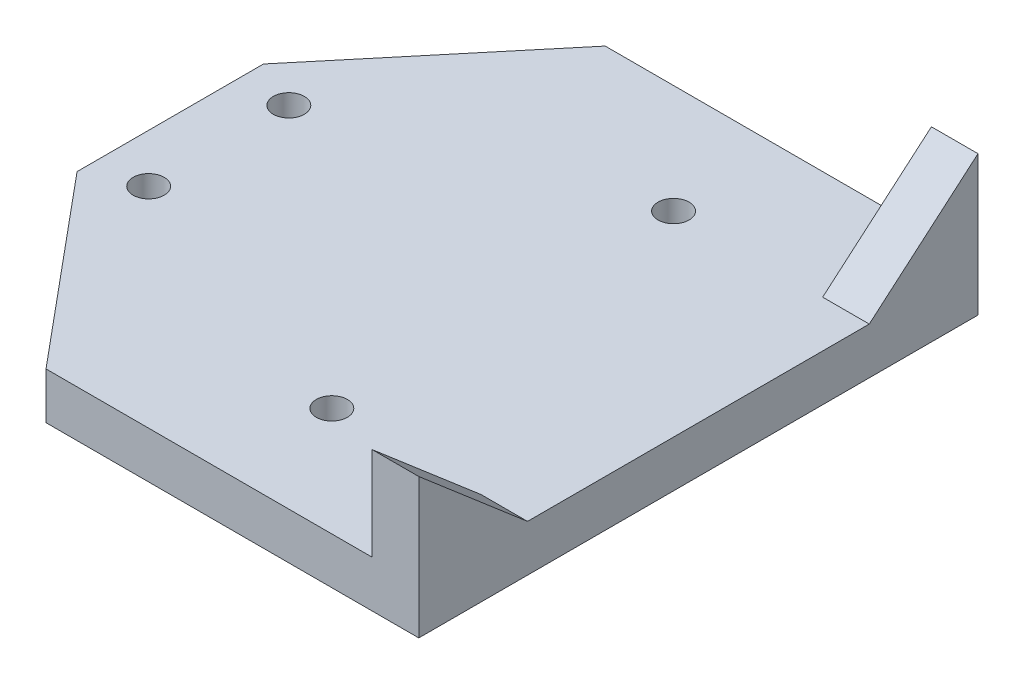
ISO-10303-21;
HEADER;
FILE_DESCRIPTION(('STEP AP214'),'2;1');
FILE_NAME('part.step','',(''),(''),'','','');
FILE_SCHEMA(('AUTOMOTIVE_DESIGN { 1 0 10303 214 1 1 1 1 }'));
ENDSEC;
DATA;
#1=APPLICATION_CONTEXT('core data for automotive mechanical design processes');
#2=APPLICATION_PROTOCOL_DEFINITION('international standard','automotive_design',2000,#1);
#3=PRODUCT_CONTEXT('',#1,'mechanical');
#4=PRODUCT('Part','Part','',(#3));
#5=PRODUCT_RELATED_PRODUCT_CATEGORY('part','',(#4));
#6=PRODUCT_DEFINITION_FORMATION('','',#4);
#7=PRODUCT_DEFINITION_CONTEXT('part definition',#1,'design');
#8=PRODUCT_DEFINITION('design','',#6,#7);
#9=PRODUCT_DEFINITION_SHAPE('','',#8);
#10=(LENGTH_UNIT() NAMED_UNIT(*) SI_UNIT(.MILLI.,.METRE.));
#11=(NAMED_UNIT(*) PLANE_ANGLE_UNIT() SI_UNIT($,.RADIAN.));
#12=(NAMED_UNIT(*) SI_UNIT($,.STERADIAN.) SOLID_ANGLE_UNIT());
#13=UNCERTAINTY_MEASURE_WITH_UNIT(LENGTH_MEASURE(1.E-05),#10,'distance_accuracy_value','');
#14=(GEOMETRIC_REPRESENTATION_CONTEXT(3) GLOBAL_UNCERTAINTY_ASSIGNED_CONTEXT((#13)) GLOBAL_UNIT_ASSIGNED_CONTEXT((#10,
#11,#12)) REPRESENTATION_CONTEXT('',''));
#15=CARTESIAN_POINT('',(0.,0.,0.));
#16=DIRECTION('',(0.,0.,1.));
#17=DIRECTION('',(1.,0.,0.));
#18=AXIS2_PLACEMENT_3D('',#15,#16,#17);
#19=CARTESIAN_POINT('',(-99.7046879555117,9.51877761939948,0.));
#20=DIRECTION('',(0.,1.,0.));
#21=DIRECTION('',(0.,0.,1.));
#22=AXIS2_PLACEMENT_3D('',#19,#20,#21);
#23=PLANE('',#22);
#24=DIRECTION('',(1.,0.,0.));
#25=VECTOR('',#24,1.);
#26=CARTESIAN_POINT('',(-112.704687955512,9.51877761939948,-11.));
#27=LINE('',#26,#25);
#28=CARTESIAN_POINT('',(-112.704687955512,9.51877761939948,-11.));
#29=VERTEX_POINT('',#28);
#30=CARTESIAN_POINT('',(-109.704687955512,9.51877761939948,-11.));
#31=VERTEX_POINT('',#30);
#32=EDGE_CURVE('E51',#29,#31,#27,.T.);
#33=ORIENTED_EDGE('',*,*,#32,.F.);
#34=DIRECTION('',(0.,0.,-1.));
#35=VECTOR('',#34,1.);
#36=CARTESIAN_POINT('',(-112.704687955512,9.51877761939948,-11.));
#37=LINE('',#36,#35);
#38=CARTESIAN_POINT('',(-112.704687955512,9.51877761939948,-18.));
#39=VERTEX_POINT('',#38);
#40=EDGE_CURVE('E124',#29,#39,#37,.T.);
#41=ORIENTED_EDGE('',*,*,#40,.T.);
#42=DIRECTION('',(-1.,0.,0.));
#43=VECTOR('',#42,1.);
#44=CARTESIAN_POINT('',(-133.704687955512,9.51877761939948,-18.));
#45=LINE('',#44,#43);
#46=CARTESIAN_POINT('',(-133.704687955512,9.51877761939948,-18.));
#47=VERTEX_POINT('',#46);
#48=EDGE_CURVE('E113',#39,#47,#45,.T.);
#49=ORIENTED_EDGE('',*,*,#48,.T.);
#50=DIRECTION('',(-0.64018439966448,0.,0.768221279597376));
#51=VECTOR('',#50,1.);
#52=CARTESIAN_POINT('',(-143.704687955512,9.51877761939948,-6.));
#53=LINE('',#52,#51);
#54=CARTESIAN_POINT('',(-143.704687955512,9.51877761939948,-6.));
#55=VERTEX_POINT('',#54);
#56=EDGE_CURVE('E122',#47,#55,#53,.T.);
#57=ORIENTED_EDGE('',*,*,#56,.T.);
#58=DIRECTION('',(0.,0.,1.));
#59=VECTOR('',#58,1.);
#60=CARTESIAN_POINT('',(-143.704687955512,9.51877761939948,-6.));
#61=LINE('',#60,#59);
#62=CARTESIAN_POINT('',(-143.704687955512,9.51877761939948,6.));
#63=VERTEX_POINT('',#62);
#64=EDGE_CURVE('E179',#55,#63,#61,.T.);
#65=ORIENTED_EDGE('',*,*,#64,.T.);
#66=DIRECTION('',(0.64018439966448,0.,0.768221279597376));
#67=VECTOR('',#66,1.);
#68=CARTESIAN_POINT('',(-143.704687955512,9.51877761939948,6.));
#69=LINE('',#68,#67);
#70=CARTESIAN_POINT('',(-133.704687955512,9.51877761939948,18.));
#71=VERTEX_POINT('',#70);
#72=EDGE_CURVE('E196',#63,#71,#69,.T.);
#73=ORIENTED_EDGE('',*,*,#72,.T.);
#74=DIRECTION('',(1.,0.,0.));
#75=VECTOR('',#74,1.);
#76=CARTESIAN_POINT('',(-133.704687955512,9.51877761939948,18.));
#77=LINE('',#76,#75);
#78=CARTESIAN_POINT('',(-112.704687955512,9.51877761939948,18.));
#79=VERTEX_POINT('',#78);
#80=EDGE_CURVE('E172',#71,#79,#77,.T.);
#81=ORIENTED_EDGE('',*,*,#80,.T.);
#82=DIRECTION('',(0.,0.,-1.));
#83=VECTOR('',#82,1.);
#84=CARTESIAN_POINT('',(-112.704687955512,9.51877761939948,18.));
#85=LINE('',#84,#83);
#86=CARTESIAN_POINT('',(-112.704687955512,9.51877761939948,11.));
#87=VERTEX_POINT('',#86);
#88=EDGE_CURVE('E145',#79,#87,#85,.T.);
#89=ORIENTED_EDGE('',*,*,#88,.T.);
#90=DIRECTION('',(1.,0.,0.));
#91=VECTOR('',#90,1.);
#92=CARTESIAN_POINT('',(-112.704687955512,9.51877761939948,11.));
#93=LINE('',#92,#91);
#94=CARTESIAN_POINT('',(-109.704687955512,9.51877761939948,11.));
#95=VERTEX_POINT('',#94);
#96=EDGE_CURVE('E144',#87,#95,#93,.T.);
#97=ORIENTED_EDGE('',*,*,#96,.T.);
#98=DIRECTION('',(0.,0.,-1.));
#99=VECTOR('',#98,1.);
#100=CARTESIAN_POINT('',(-109.704687955512,9.51877761939948,-18.));
#101=LINE('',#100,#99);
#102=EDGE_CURVE('E56',#95,#31,#101,.T.);
#103=ORIENTED_EDGE('',*,*,#102,.T.);
#104=EDGE_LOOP('',(#33,#41,#49,#57,#65,#73,#81,#89,#97,#103));
#105=FACE_BOUND('',#104,.T.);
#106=CARTESIAN_POINT('',(-140.582534376525,9.51877761939948,-4.51147900978412));
#107=DIRECTION('',(0.,1.,0.));
#108=DIRECTION('',(0.,0.,1.));
#109=AXIS2_PLACEMENT_3D('',#106,#107,#108);
#110=CIRCLE('',#109,0.999999999999995);
#111=CARTESIAN_POINT('',(-140.582534376525,9.51877761939948,-3.51147900978413));
#112=VERTEX_POINT('',#111);
#113=EDGE_CURVE('E228',#112,#112,#110,.T.);
#114=ORIENTED_EDGE('',*,*,#113,.F.);
#115=EDGE_LOOP('',(#114));
#116=FACE_BOUND('',#115,.T.);
#117=CARTESIAN_POINT('',(-122.303946928745,9.51877761939948,11.));
#118=DIRECTION('',(0.,1.,0.));
#119=DIRECTION('',(0.,0.,1.));
#120=AXIS2_PLACEMENT_3D('',#117,#118,#119);
#121=CIRCLE('',#120,0.999999999999998);
#122=CARTESIAN_POINT('',(-122.303946928745,9.51877761939948,12.));
#123=VERTEX_POINT('',#122);
#124=EDGE_CURVE('E234',#123,#123,#121,.T.);
#125=ORIENTED_EDGE('',*,*,#124,.F.);
#126=EDGE_LOOP('',(#125));
#127=FACE_BOUND('',#126,.T.);
#128=CARTESIAN_POINT('',(-122.303946928745,9.51877761939948,-11.));
#129=DIRECTION('',(0.,1.,0.));
#130=DIRECTION('',(0.,0.,1.));
#131=AXIS2_PLACEMENT_3D('',#128,#129,#130);
#132=CIRCLE('',#131,0.999999999999998);
#133=CARTESIAN_POINT('',(-122.303946928745,9.51877761939948,-10.));
#134=VERTEX_POINT('',#133);
#135=EDGE_CURVE('E240',#134,#134,#132,.T.);
#136=ORIENTED_EDGE('',*,*,#135,.F.);
#137=EDGE_LOOP('',(#136));
#138=FACE_BOUND('',#137,.T.);
#139=CARTESIAN_POINT('',(-140.582534376525,9.51877761939948,4.51147900978413));
#140=DIRECTION('',(0.,1.,0.));
#141=DIRECTION('',(0.,0.,1.));
#142=AXIS2_PLACEMENT_3D('',#139,#140,#141);
#143=CIRCLE('',#142,0.999999999999995);
#144=CARTESIAN_POINT('',(-140.582534376525,9.51877761939948,5.51147900978412));
#145=VERTEX_POINT('',#144);
#146=EDGE_CURVE('E149',#145,#145,#143,.T.);
#147=ORIENTED_EDGE('',*,*,#146,.F.);
#148=EDGE_LOOP('',(#147));
#149=FACE_BOUND('',#148,.T.);
#150=ADVANCED_FACE('F34',(#105,#116,#127,#138,#149),#23,.T.);
#151=CARTESIAN_POINT('',(-143.704687955512,9.51877761939948,6.));
#152=DIRECTION('',(0.768221279597376,0.,-0.64018439966448));
#153=DIRECTION('',(-0.64018439966448,0.,-0.768221279597376));
#154=AXIS2_PLACEMENT_3D('',#151,#152,#153);
#155=PLANE('',#154);
#156=DIRECTION('',(0.64018439966448,0.,0.768221279597376));
#157=VECTOR('',#156,1.);
#158=CARTESIAN_POINT('',(-143.704687955512,6.51877761939948,6.));
#159=LINE('',#158,#157);
#160=CARTESIAN_POINT('',(-143.704687955512,6.51877761939948,6.));
#161=VERTEX_POINT('',#160);
#162=CARTESIAN_POINT('',(-133.704687955512,6.51877761939948,18.));
#163=VERTEX_POINT('',#162);
#164=EDGE_CURVE('E182',#161,#163,#159,.T.);
#165=ORIENTED_EDGE('',*,*,#164,.T.);
#166=DIRECTION('',(0.,-1.,0.));
#167=VECTOR('',#166,1.);
#168=CARTESIAN_POINT('',(-133.704687955512,9.51877761939948,18.));
#169=LINE('',#168,#167);
#170=EDGE_CURVE('E11',#71,#163,#169,.T.);
#171=ORIENTED_EDGE('',*,*,#170,.F.);
#172=ORIENTED_EDGE('',*,*,#72,.F.);
#173=DIRECTION('',(0.,-1.,0.));
#174=VECTOR('',#173,1.);
#175=CARTESIAN_POINT('',(-143.704687955512,9.51877761939948,6.));
#176=LINE('',#175,#174);
#177=EDGE_CURVE('E181',#63,#161,#176,.T.);
#178=ORIENTED_EDGE('',*,*,#177,.T.);
#179=EDGE_LOOP('',(#165,#171,#172,#178));
#180=FACE_BOUND('',#179,.T.);
#181=ADVANCED_FACE('F36',(#180),#155,.F.);
#182=CARTESIAN_POINT('',(-133.704687955512,9.51877761939948,18.));
#183=DIRECTION('',(0.,0.,-1.));
#184=DIRECTION('',(-1.,0.,0.));
#185=AXIS2_PLACEMENT_3D('',#182,#183,#184);
#186=PLANE('',#185);
#187=DIRECTION('',(1.,0.,0.));
#188=VECTOR('',#187,1.);
#189=CARTESIAN_POINT('',(-133.704687955512,6.51877761939948,18.));
#190=LINE('',#189,#188);
#191=CARTESIAN_POINT('',(-109.704687955512,6.51877761939948,18.));
#192=VERTEX_POINT('',#191);
#193=EDGE_CURVE('E185',#163,#192,#190,.T.);
#194=ORIENTED_EDGE('',*,*,#193,.T.);
#195=DIRECTION('',(0.,-1.,0.));
#196=VECTOR('',#195,1.);
#197=CARTESIAN_POINT('',(-109.704687955512,9.51877761939948,18.));
#198=LINE('',#197,#196);
#199=CARTESIAN_POINT('',(-109.704687955512,15.5187776193995,18.));
#200=VERTEX_POINT('',#199);
#201=EDGE_CURVE('E43',#200,#192,#198,.T.);
#202=ORIENTED_EDGE('',*,*,#201,.F.);
#203=DIRECTION('',(1.,0.,0.));
#204=VECTOR('',#203,1.);
#205=CARTESIAN_POINT('',(-112.704687955512,15.5187776193995,18.));
#206=LINE('',#205,#204);
#207=CARTESIAN_POINT('',(-112.704687955512,15.5187776193995,18.));
#208=VERTEX_POINT('',#207);
#209=EDGE_CURVE('E146',#208,#200,#206,.T.);
#210=ORIENTED_EDGE('',*,*,#209,.F.);
#211=DIRECTION('',(0.,-1.,0.));
#212=VECTOR('',#211,1.);
#213=CARTESIAN_POINT('',(-112.704687955512,9.51877761939948,18.));
#214=LINE('',#213,#212);
#215=EDGE_CURVE('E160',#208,#79,#214,.T.);
#216=ORIENTED_EDGE('',*,*,#215,.T.);
#217=ORIENTED_EDGE('',*,*,#80,.F.);
#218=ORIENTED_EDGE('',*,*,#170,.T.);
#219=EDGE_LOOP('',(#194,#202,#210,#216,#217,#218));
#220=FACE_BOUND('',#219,.T.);
#221=ADVANCED_FACE('F256',(#220),#186,.F.);
#222=CARTESIAN_POINT('',(-109.704687955512,9.51877761939948,-18.));
#223=DIRECTION('',(-1.,0.,0.));
#224=DIRECTION('',(0.,0.,1.));
#225=AXIS2_PLACEMENT_3D('',#222,#223,#224);
#226=PLANE('',#225);
#227=DIRECTION('',(0.,0.,-1.));
#228=VECTOR('',#227,1.);
#229=CARTESIAN_POINT('',(-109.704687955512,6.51877761939948,-18.));
#230=LINE('',#229,#228);
#231=CARTESIAN_POINT('',(-109.704687955512,6.51877761939948,-18.));
#232=VERTEX_POINT('',#231);
#233=EDGE_CURVE('E188',#192,#232,#230,.T.);
#234=ORIENTED_EDGE('',*,*,#233,.T.);
#235=DIRECTION('',(0.,-1.,0.));
#236=VECTOR('',#235,1.);
#237=CARTESIAN_POINT('',(-109.704687955512,9.51877761939948,-18.));
#238=LINE('',#237,#236);
#239=CARTESIAN_POINT('',(-109.704687955512,15.5187776193995,-18.));
#240=VERTEX_POINT('',#239);
#241=EDGE_CURVE('E203',#240,#232,#238,.T.);
#242=ORIENTED_EDGE('',*,*,#241,.F.);
#243=DIRECTION('',(0.,-0.650791373455969,0.759256602365296));
#244=VECTOR('',#243,1.);
#245=CARTESIAN_POINT('',(-109.704687955512,15.5187776193995,-18.));
#246=LINE('',#245,#244);
#247=EDGE_CURVE('E128',#240,#31,#246,.T.);
#248=ORIENTED_EDGE('',*,*,#247,.T.);
#249=ORIENTED_EDGE('',*,*,#102,.F.);
#250=DIRECTION('',(0.,0.650791373455968,0.759256602365297));
#251=VECTOR('',#250,1.);
#252=CARTESIAN_POINT('',(-109.704687955512,15.5187776193995,18.));
#253=LINE('',#252,#251);
#254=EDGE_CURVE('E139',#95,#200,#253,.T.);
#255=ORIENTED_EDGE('',*,*,#254,.T.);
#256=ORIENTED_EDGE('',*,*,#201,.T.);
#257=EDGE_LOOP('',(#234,#242,#248,#249,#255,#256));
#258=FACE_BOUND('',#257,.T.);
#259=ADVANCED_FACE('F207',(#258),#226,.F.);
#260=CARTESIAN_POINT('',(-133.704687955512,9.51877761939948,-18.));
#261=DIRECTION('',(0.,0.,1.));
#262=DIRECTION('',(1.,0.,0.));
#263=AXIS2_PLACEMENT_3D('',#260,#261,#262);
#264=PLANE('',#263);
#265=DIRECTION('',(-1.,0.,0.));
#266=VECTOR('',#265,1.);
#267=CARTESIAN_POINT('',(-133.704687955512,6.51877761939948,-18.));
#268=LINE('',#267,#266);
#269=CARTESIAN_POINT('',(-133.704687955512,6.51877761939948,-18.));
#270=VERTEX_POINT('',#269);
#271=EDGE_CURVE('E190',#232,#270,#268,.T.);
#272=ORIENTED_EDGE('',*,*,#271,.T.);
#273=DIRECTION('',(0.,-1.,0.));
#274=VECTOR('',#273,1.);
#275=CARTESIAN_POINT('',(-133.704687955512,9.51877761939948,-18.));
#276=LINE('',#275,#274);
#277=EDGE_CURVE('E120',#47,#270,#276,.T.);
#278=ORIENTED_EDGE('',*,*,#277,.F.);
#279=ORIENTED_EDGE('',*,*,#48,.F.);
#280=DIRECTION('',(0.,1.,0.));
#281=VECTOR('',#280,1.);
#282=CARTESIAN_POINT('',(-112.704687955512,15.5187776193995,-18.));
#283=LINE('',#282,#281);
#284=CARTESIAN_POINT('',(-112.704687955512,15.5187776193995,-18.));
#285=VERTEX_POINT('',#284);
#286=EDGE_CURVE('E117',#39,#285,#283,.T.);
#287=ORIENTED_EDGE('',*,*,#286,.T.);
#288=DIRECTION('',(1.,0.,0.));
#289=VECTOR('',#288,1.);
#290=CARTESIAN_POINT('',(-112.704687955512,15.5187776193995,-18.));
#291=LINE('',#290,#289);
#292=EDGE_CURVE('E133',#285,#240,#291,.T.);
#293=ORIENTED_EDGE('',*,*,#292,.T.);
#294=ORIENTED_EDGE('',*,*,#241,.T.);
#295=EDGE_LOOP('',(#272,#278,#279,#287,#293,#294));
#296=FACE_BOUND('',#295,.T.);
#297=ADVANCED_FACE('F114',(#296),#264,.F.);
#298=CARTESIAN_POINT('',(-143.704687955512,9.51877761939948,-6.));
#299=DIRECTION('',(0.768221279597376,0.,0.64018439966448));
#300=DIRECTION('',(0.64018439966448,0.,-0.768221279597376));
#301=AXIS2_PLACEMENT_3D('',#298,#299,#300);
#302=PLANE('',#301);
#303=DIRECTION('',(-0.64018439966448,0.,0.768221279597376));
#304=VECTOR('',#303,1.);
#305=CARTESIAN_POINT('',(-143.704687955512,6.51877761939948,-6.));
#306=LINE('',#305,#304);
#307=CARTESIAN_POINT('',(-143.704687955512,6.51877761939948,-6.));
#308=VERTEX_POINT('',#307);
#309=EDGE_CURVE('E192',#270,#308,#306,.T.);
#310=ORIENTED_EDGE('',*,*,#309,.T.);
#311=DIRECTION('',(0.,-1.,0.));
#312=VECTOR('',#311,1.);
#313=CARTESIAN_POINT('',(-143.704687955512,9.51877761939948,-6.));
#314=LINE('',#313,#312);
#315=EDGE_CURVE('E199',#55,#308,#314,.T.);
#316=ORIENTED_EDGE('',*,*,#315,.F.);
#317=ORIENTED_EDGE('',*,*,#56,.F.);
#318=ORIENTED_EDGE('',*,*,#277,.T.);
#319=EDGE_LOOP('',(#310,#316,#317,#318));
#320=FACE_BOUND('',#319,.T.);
#321=ADVANCED_FACE('F215',(#320),#302,.F.);
#322=CARTESIAN_POINT('',(-143.704687955512,9.51877761939948,-6.));
#323=DIRECTION('',(1.,0.,0.));
#324=DIRECTION('',(0.,0.,-1.));
#325=AXIS2_PLACEMENT_3D('',#322,#323,#324);
#326=PLANE('',#325);
#327=DIRECTION('',(0.,0.,1.));
#328=VECTOR('',#327,1.);
#329=CARTESIAN_POINT('',(-143.704687955512,6.51877761939948,-6.));
#330=LINE('',#329,#328);
#331=EDGE_CURVE('E194',#308,#161,#330,.T.);
#332=ORIENTED_EDGE('',*,*,#331,.T.);
#333=ORIENTED_EDGE('',*,*,#177,.F.);
#334=ORIENTED_EDGE('',*,*,#64,.F.);
#335=ORIENTED_EDGE('',*,*,#315,.T.);
#336=EDGE_LOOP('',(#332,#333,#334,#335));
#337=FACE_BOUND('',#336,.T.);
#338=ADVANCED_FACE('F223',(#337),#326,.F.);
#339=CARTESIAN_POINT('',(-99.7046879555117,6.51877761939948,0.));
#340=DIRECTION('',(0.,1.,0.));
#341=DIRECTION('',(0.,0.,1.));
#342=AXIS2_PLACEMENT_3D('',#339,#340,#341);
#343=PLANE('',#342);
#344=CARTESIAN_POINT('',(-140.582534376525,6.51877761939948,4.51147900978413));
#345=DIRECTION('',(0.,1.,0.));
#346=DIRECTION('',(0.,0.,1.));
#347=AXIS2_PLACEMENT_3D('',#344,#345,#346);
#348=CIRCLE('',#347,1.);
#349=CARTESIAN_POINT('',(-140.582534376525,6.51877761939948,5.51147900978413));
#350=VERTEX_POINT('',#349);
#351=EDGE_CURVE('E242',#350,#350,#348,.T.);
#352=ORIENTED_EDGE('',*,*,#351,.T.);
#353=EDGE_LOOP('',(#352));
#354=FACE_BOUND('',#353,.T.);
#355=CARTESIAN_POINT('',(-122.303946928745,6.51877761939948,-11.));
#356=DIRECTION('',(0.,1.,0.));
#357=DIRECTION('',(0.,0.,1.));
#358=AXIS2_PLACEMENT_3D('',#355,#356,#357);
#359=CIRCLE('',#358,0.999999999999998);
#360=CARTESIAN_POINT('',(-122.303946928745,6.51877761939948,-10.));
#361=VERTEX_POINT('',#360);
#362=EDGE_CURVE('E237',#361,#361,#359,.T.);
#363=ORIENTED_EDGE('',*,*,#362,.T.);
#364=EDGE_LOOP('',(#363));
#365=FACE_BOUND('',#364,.T.);
#366=CARTESIAN_POINT('',(-122.303946928745,6.51877761939948,11.));
#367=DIRECTION('',(0.,1.,0.));
#368=DIRECTION('',(0.,0.,1.));
#369=AXIS2_PLACEMENT_3D('',#366,#367,#368);
#370=CIRCLE('',#369,0.999999999999998);
#371=CARTESIAN_POINT('',(-122.303946928745,6.51877761939948,12.));
#372=VERTEX_POINT('',#371);
#373=EDGE_CURVE('E231',#372,#372,#370,.T.);
#374=ORIENTED_EDGE('',*,*,#373,.T.);
#375=EDGE_LOOP('',(#374));
#376=FACE_BOUND('',#375,.T.);
#377=CARTESIAN_POINT('',(-140.582534376525,6.51877761939948,-4.51147900978412));
#378=DIRECTION('',(0.,1.,0.));
#379=DIRECTION('',(0.,0.,1.));
#380=AXIS2_PLACEMENT_3D('',#377,#378,#379);
#381=CIRCLE('',#380,1.);
#382=CARTESIAN_POINT('',(-140.582534376525,6.51877761939948,-3.51147900978412));
#383=VERTEX_POINT('',#382);
#384=EDGE_CURVE('E186',#383,#383,#381,.T.);
#385=ORIENTED_EDGE('',*,*,#384,.T.);
#386=EDGE_LOOP('',(#385));
#387=FACE_BOUND('',#386,.T.);
#388=ORIENTED_EDGE('',*,*,#164,.F.);
#389=ORIENTED_EDGE('',*,*,#331,.F.);
#390=ORIENTED_EDGE('',*,*,#309,.F.);
#391=ORIENTED_EDGE('',*,*,#271,.F.);
#392=ORIENTED_EDGE('',*,*,#233,.F.);
#393=ORIENTED_EDGE('',*,*,#193,.F.);
#394=EDGE_LOOP('',(#388,#389,#390,#391,#392,#393));
#395=FACE_BOUND('',#394,.T.);
#396=ADVANCED_FACE('F211',(#354,#365,#376,#387,#395),#343,.F.);
#397=CARTESIAN_POINT('',(-140.582534376525,9.51877761939948,-4.51147900978412));
#398=DIRECTION('',(0.,1.,0.));
#399=DIRECTION('',(0.,0.,1.));
#400=AXIS2_PLACEMENT_3D('',#397,#398,#399);
#401=CYLINDRICAL_SURFACE('',#400,0.999999999999998);
#402=ORIENTED_EDGE('',*,*,#384,.F.);
#403=EDGE_LOOP('',(#402));
#404=FACE_BOUND('',#403,.T.);
#405=ORIENTED_EDGE('',*,*,#113,.T.);
#406=EDGE_LOOP('',(#405));
#407=FACE_BOUND('',#406,.T.);
#408=ADVANCED_FACE('F259',(#404,#407),#401,.F.);
#409=CARTESIAN_POINT('',(-122.303946928745,9.51877761939948,11.));
#410=DIRECTION('',(0.,1.,0.));
#411=DIRECTION('',(0.,0.,1.));
#412=AXIS2_PLACEMENT_3D('',#409,#410,#411);
#413=CYLINDRICAL_SURFACE('',#412,0.999999999999998);
#414=ORIENTED_EDGE('',*,*,#373,.F.);
#415=EDGE_LOOP('',(#414));
#416=FACE_BOUND('',#415,.T.);
#417=ORIENTED_EDGE('',*,*,#124,.T.);
#418=EDGE_LOOP('',(#417));
#419=FACE_BOUND('',#418,.T.);
#420=ADVANCED_FACE('F292',(#416,#419),#413,.F.);
#421=CARTESIAN_POINT('',(-122.303946928745,9.51877761939948,-11.));
#422=DIRECTION('',(0.,1.,0.));
#423=DIRECTION('',(0.,0.,1.));
#424=AXIS2_PLACEMENT_3D('',#421,#422,#423);
#425=CYLINDRICAL_SURFACE('',#424,0.999999999999998);
#426=ORIENTED_EDGE('',*,*,#362,.F.);
#427=EDGE_LOOP('',(#426));
#428=FACE_BOUND('',#427,.T.);
#429=ORIENTED_EDGE('',*,*,#135,.T.);
#430=EDGE_LOOP('',(#429));
#431=FACE_BOUND('',#430,.T.);
#432=ADVANCED_FACE('F286',(#428,#431),#425,.F.);
#433=CARTESIAN_POINT('',(-140.582534376525,9.51877761939948,4.51147900978413));
#434=DIRECTION('',(0.,1.,0.));
#435=DIRECTION('',(0.,0.,1.));
#436=AXIS2_PLACEMENT_3D('',#433,#434,#435);
#437=CYLINDRICAL_SURFACE('',#436,0.999999999999998);
#438=ORIENTED_EDGE('',*,*,#351,.F.);
#439=EDGE_LOOP('',(#438));
#440=FACE_BOUND('',#439,.T.);
#441=ORIENTED_EDGE('',*,*,#146,.T.);
#442=EDGE_LOOP('',(#441));
#443=FACE_BOUND('',#442,.T.);
#444=ADVANCED_FACE('F249',(#440,#443),#437,.F.);
#445=CARTESIAN_POINT('',(-112.704687955512,15.5187776193995,18.));
#446=DIRECTION('',(0.,0.759256602365297,-0.650791373455968));
#447=DIRECTION('',(0.,0.650791373455968,0.759256602365297));
#448=AXIS2_PLACEMENT_3D('',#445,#446,#447);
#449=PLANE('',#448);
#450=ORIENTED_EDGE('',*,*,#254,.F.);
#451=ORIENTED_EDGE('',*,*,#96,.F.);
#452=DIRECTION('',(0.,0.650791373455968,0.759256602365297));
#453=VECTOR('',#452,1.);
#454=CARTESIAN_POINT('',(-112.704687955512,15.5187776193995,18.));
#455=LINE('',#454,#453);
#456=EDGE_CURVE('E141',#87,#208,#455,.T.);
#457=ORIENTED_EDGE('',*,*,#456,.T.);
#458=ORIENTED_EDGE('',*,*,#209,.T.);
#459=EDGE_LOOP('',(#450,#451,#457,#458));
#460=FACE_BOUND('',#459,.T.);
#461=ADVANCED_FACE('F277',(#460),#449,.T.);
#462=CARTESIAN_POINT('',(-112.704687955512,6.51877761939948,0.));
#463=DIRECTION('',(-1.,0.,0.));
#464=DIRECTION('',(0.,0.,1.));
#465=AXIS2_PLACEMENT_3D('',#462,#463,#464);
#466=PLANE('',#465);
#467=ORIENTED_EDGE('',*,*,#215,.F.);
#468=ORIENTED_EDGE('',*,*,#456,.F.);
#469=ORIENTED_EDGE('',*,*,#88,.F.);
#470=EDGE_LOOP('',(#467,#468,#469));
#471=FACE_BOUND('',#470,.T.);
#472=ADVANCED_FACE('F275',(#471),#466,.T.);
#473=CARTESIAN_POINT('',(-112.704687955512,15.5187776193995,-18.));
#474=DIRECTION('',(0.,0.759256602365297,0.650791373455969));
#475=DIRECTION('',(0.,-0.650791373455969,0.759256602365297));
#476=AXIS2_PLACEMENT_3D('',#473,#474,#475);
#477=PLANE('',#476);
#478=ORIENTED_EDGE('',*,*,#247,.F.);
#479=ORIENTED_EDGE('',*,*,#292,.F.);
#480=DIRECTION('',(0.,-0.650791373455969,0.759256602365296));
#481=VECTOR('',#480,1.);
#482=CARTESIAN_POINT('',(-112.704687955512,15.5187776193995,-18.));
#483=LINE('',#482,#481);
#484=EDGE_CURVE('E131',#285,#29,#483,.T.);
#485=ORIENTED_EDGE('',*,*,#484,.T.);
#486=ORIENTED_EDGE('',*,*,#32,.T.);
#487=EDGE_LOOP('',(#478,#479,#485,#486));
#488=FACE_BOUND('',#487,.T.);
#489=ADVANCED_FACE('F284',(#488),#477,.T.);
#490=CARTESIAN_POINT('',(-112.704687955512,6.51877761939948,0.));
#491=DIRECTION('',(-1.,0.,0.));
#492=DIRECTION('',(0.,0.,1.));
#493=AXIS2_PLACEMENT_3D('',#490,#491,#492);
#494=PLANE('',#493);
#495=ORIENTED_EDGE('',*,*,#40,.F.);
#496=ORIENTED_EDGE('',*,*,#484,.F.);
#497=ORIENTED_EDGE('',*,*,#286,.F.);
#498=EDGE_LOOP('',(#495,#496,#497));
#499=FACE_BOUND('',#498,.T.);
#500=ADVANCED_FACE('F130',(#499),#494,.T.);
#501=CLOSED_SHELL('',(#150,#181,#221,#259,#297,#321,#338,#396,#408,#420,#432,#444,#461,#472,
#489,#500));
#502=MANIFOLD_SOLID_BREP('B2',#501);
#503=ADVANCED_BREP_SHAPE_REPRESENTATION('',(#18,#502),#14);
#504=SHAPE_DEFINITION_REPRESENTATION(#9,#503);
ENDSEC;
END-ISO-10303-21;
